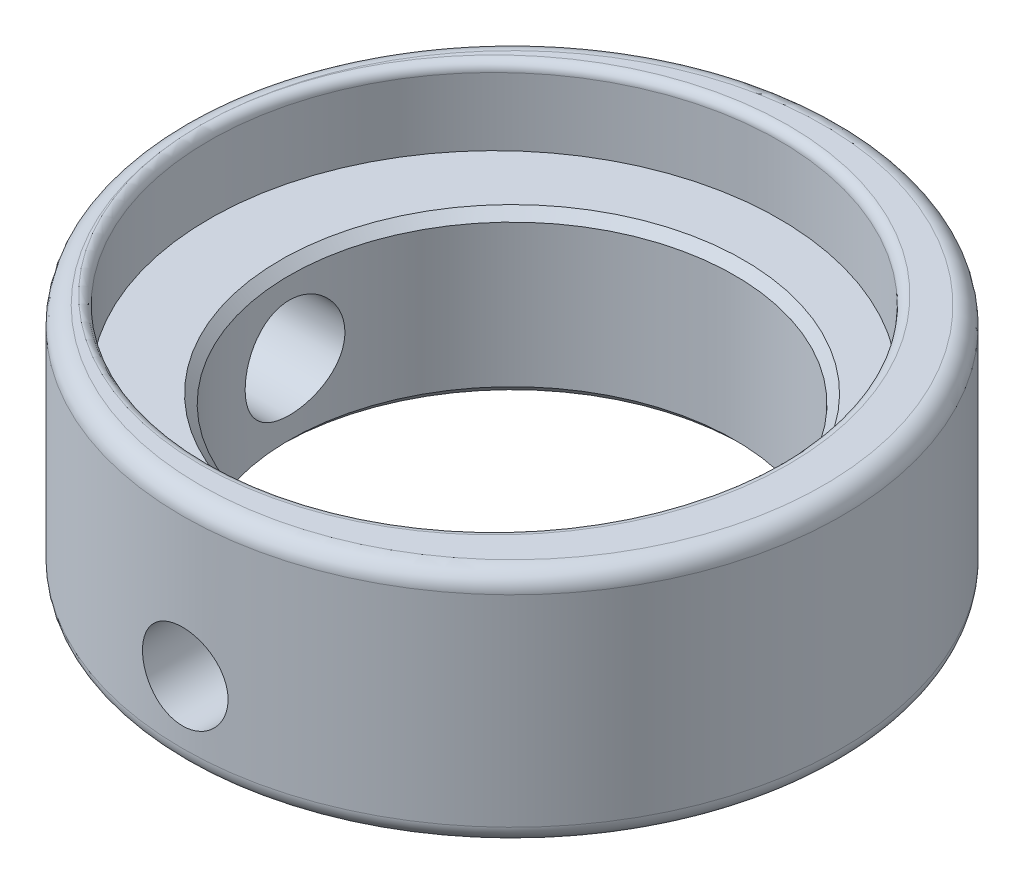
ISO-10303-21;
HEADER;
FILE_DESCRIPTION(('STEP AP214'),'2;1');
FILE_NAME('part.step','',(''),(''),'','','');
FILE_SCHEMA(('AUTOMOTIVE_DESIGN { 1 0 10303 214 1 1 1 1 }'));
ENDSEC;
DATA;
#1=APPLICATION_CONTEXT('core data for automotive mechanical design processes');
#2=APPLICATION_PROTOCOL_DEFINITION('international standard','automotive_design',2000,#1);
#3=PRODUCT_CONTEXT('',#1,'mechanical');
#4=PRODUCT('Part','Part','',(#3));
#5=PRODUCT_RELATED_PRODUCT_CATEGORY('part','',(#4));
#6=PRODUCT_DEFINITION_FORMATION('','',#4);
#7=PRODUCT_DEFINITION_CONTEXT('part definition',#1,'design');
#8=PRODUCT_DEFINITION('design','',#6,#7);
#9=PRODUCT_DEFINITION_SHAPE('','',#8);
#10=(LENGTH_UNIT() NAMED_UNIT(*) SI_UNIT(.MILLI.,.METRE.));
#11=(NAMED_UNIT(*) PLANE_ANGLE_UNIT() SI_UNIT($,.RADIAN.));
#12=(NAMED_UNIT(*) SI_UNIT($,.STERADIAN.) SOLID_ANGLE_UNIT());
#13=UNCERTAINTY_MEASURE_WITH_UNIT(LENGTH_MEASURE(1.E-05),#10,'distance_accuracy_value','');
#14=(GEOMETRIC_REPRESENTATION_CONTEXT(3) GLOBAL_UNCERTAINTY_ASSIGNED_CONTEXT((#13)) GLOBAL_UNIT_ASSIGNED_CONTEXT((#10,
#11,#12)) REPRESENTATION_CONTEXT('',''));
#15=CARTESIAN_POINT('',(0.,0.,0.));
#16=DIRECTION('',(0.,0.,1.));
#17=DIRECTION('',(1.,0.,0.));
#18=AXIS2_PLACEMENT_3D('',#15,#16,#17);
#19=CARTESIAN_POINT('',(0.,13.3,0.));
#20=DIRECTION('',(0.,-1.,0.));
#21=DIRECTION('',(0.,0.,-1.));
#22=AXIS2_PLACEMENT_3D('',#19,#20,#21);
#23=CYLINDRICAL_SURFACE('',#22,12.5);
#24=CARTESIAN_POINT('',(0.,0.500000000000006,0.));
#25=DIRECTION('',(0.,1.,0.));
#26=DIRECTION('',(0.,0.,1.));
#27=AXIS2_PLACEMENT_3D('',#24,#25,#26);
#28=CIRCLE('',#27,12.5);
#29=CARTESIAN_POINT('',(0.,0.500000000000006,12.5));
#30=VERTEX_POINT('',#29);
#31=EDGE_CURVE('E81',#30,#30,#28,.F.);
#32=ORIENTED_EDGE('',*,*,#31,.T.);
#33=EDGE_LOOP('',(#32));
#34=FACE_BOUND('',#33,.T.);
#35=CARTESIAN_POINT('',(0.,8.49999999999999,0.));
#36=DIRECTION('',(0.,1.,0.));
#37=DIRECTION('',(0.,0.,1.));
#38=AXIS2_PLACEMENT_3D('',#35,#36,#37);
#39=CIRCLE('',#38,12.5);
#40=CARTESIAN_POINT('',(0.,8.49999999999999,12.5));
#41=VERTEX_POINT('',#40);
#42=EDGE_CURVE('E71',#41,#41,#39,.T.);
#43=ORIENTED_EDGE('',*,*,#42,.T.);
#44=EDGE_LOOP('',(#43));
#45=FACE_BOUND('',#44,.T.);
#46=CARTESIAN_POINT('',(-12.1823643025482,4.5,-2.8));
#47=CARTESIAN_POINT('',(-12.1823674341913,4.65514536392574,-2.79999479581896));
#48=CARTESIAN_POINT('',(-12.1853603182129,4.81035243648876,-2.78706144254922));
#49=CARTESIAN_POINT('',(-12.1969851330559,5.11634588547394,-2.73573044738615));
#50=CARTESIAN_POINT('',(-12.2056210123745,5.26712908919167,-2.69731497494632));
#51=CARTESIAN_POINT('',(-12.2275057982099,5.55980433395264,-2.59629573068127));
#52=CARTESIAN_POINT('',(-12.2407494999159,5.70170619451899,-2.53371924145354));
#53=CARTESIAN_POINT('',(-12.2703514049555,5.9730026802323,-2.38623324156795));
#54=CARTESIAN_POINT('',(-12.2867095761564,6.10239743439727,-2.30132396131933));
#55=CARTESIAN_POINT('',(-12.321020992254,6.34729938377163,-2.10997945418038));
#56=CARTESIAN_POINT('',(-12.3389954791481,6.46255278921464,-2.00322315327442));
#57=CARTESIAN_POINT('',(-12.3743285676773,6.67367561832833,-1.77190791213655));
#58=CARTESIAN_POINT('',(-12.3916871198821,6.76954348914843,-1.64734754709853));
#59=CARTESIAN_POINT('',(-12.4240644422573,6.94018335427823,-1.38225241629933));
#60=CARTESIAN_POINT('',(-12.4390552233858,7.01471040620082,-1.24155627007642));
#61=CARTESIAN_POINT('',(-12.4647676200736,7.13896713585974,-0.949244449826382));
#62=CARTESIAN_POINT('',(-12.4754897384779,7.18869973453641,-0.797630064445024));
#63=CARTESIAN_POINT('',(-12.491306599197,7.26115525674994,-0.490425600222609));
#64=CARTESIAN_POINT('',(-12.4964907868747,7.28430795633644,-0.334941569183739));
#65=CARTESIAN_POINT('',(-12.5009578577556,7.30429103976193,-0.0222156262446369));
#66=CARTESIAN_POINT('',(-12.5002414476418,7.30112457570607,0.135026072896531));
#67=CARTESIAN_POINT('',(-12.4930561186334,7.26887755292201,0.443838229000937));
#68=CARTESIAN_POINT('',(-12.486690058832,7.24026033792319,0.595459816367369));
#69=CARTESIAN_POINT('',(-12.4690383191829,7.15866352461863,0.8916922023733));
#70=CARTESIAN_POINT('',(-12.4577524099078,7.10568279016194,1.03630267371374));
#71=CARTESIAN_POINT('',(-12.4313649323818,6.97645869198745,1.31568358483893));
#72=CARTESIAN_POINT('',(-12.4162349904277,6.90004142871706,1.4503707999034));
#73=CARTESIAN_POINT('',(-12.3838156566355,6.72624348326085,1.70517795035637));
#74=CARTESIAN_POINT('',(-12.3665259574272,6.62885981576816,1.82529580747143));
#75=CARTESIAN_POINT('',(-12.3312406041664,6.41337685287638,2.05031174025003));
#76=CARTESIAN_POINT('',(-12.3132377774948,6.29487208654792,2.15482075247097));
#77=CARTESIAN_POINT('',(-12.2789071379515,6.04183160574922,2.34255720249526));
#78=CARTESIAN_POINT('',(-12.2625793750915,5.90729541289273,2.42578400499298));
#79=CARTESIAN_POINT('',(-12.2334273969985,5.62536085655811,2.56877828276755));
#80=CARTESIAN_POINT('',(-12.2206146783272,5.47792231945013,2.62846905124591));
#81=CARTESIAN_POINT('',(-12.2001005139821,5.17475140783082,2.72210751155543));
#82=CARTESIAN_POINT('',(-12.1923982135573,5.0190204249949,2.75605950850093));
#83=CARTESIAN_POINT('',(-12.1831521517488,4.70724881794293,2.79664653475807));
#84=CARTESIAN_POINT('',(-12.1814803802331,4.55128583348394,2.80384946589389));
#85=CARTESIAN_POINT('',(-12.1841388420204,4.2403875214988,2.79227419334111));
#86=CARTESIAN_POINT('',(-12.1884686411874,4.08545212045485,2.77349786891566));
#87=CARTESIAN_POINT('',(-12.2025212112885,3.78300514151785,2.71099068139143));
#88=CARTESIAN_POINT('',(-12.2121757325051,3.63542487069364,2.66757542807073));
#89=CARTESIAN_POINT('',(-12.2357278409602,3.34963366297215,2.55736580494411));
#90=CARTESIAN_POINT('',(-12.249625850476,3.21142366020099,2.49056910831074));
#91=CARTESIAN_POINT('',(-12.2803783440658,2.94584684216637,2.33425162127811));
#92=CARTESIAN_POINT('',(-12.2972767822172,2.81869016766377,2.24438263713553));
#93=CARTESIAN_POINT('',(-12.3320115187574,2.58105397854603,2.04492474154269));
#94=CARTESIAN_POINT('',(-12.3498479393713,2.47057664465242,1.93533325559501));
#95=CARTESIAN_POINT('',(-12.3848728054435,2.26721559129358,1.69696547292542));
#96=CARTESIAN_POINT('',(-12.4020416474021,2.17471997977805,1.56785468974046));
#97=CARTESIAN_POINT('',(-12.4334296676744,2.01273023518556,1.29559856934823));
#98=CARTESIAN_POINT('',(-12.4476489871673,1.94323500109963,1.15245390435656));
#99=CARTESIAN_POINT('',(-12.4714535105365,1.82975158697143,0.857106232323216));
#100=CARTESIAN_POINT('',(-12.4810687862438,1.7855975010361,0.704969506963423));
#101=CARTESIAN_POINT('',(-12.4947121499458,1.72353431936234,0.395197133529021));
#102=CARTESIAN_POINT('',(-12.4987410920213,1.70562121168202,0.237562329820752));
#103=CARTESIAN_POINT('',(-12.5007309491807,1.69673619919542,-0.0750535642039317));
#104=CARTESIAN_POINT('',(-12.4988221242732,1.70518596985465,-0.230017668576181));
#105=CARTESIAN_POINT('',(-12.4894315694838,1.74748830842547,-0.536257306341028));
#106=CARTESIAN_POINT('',(-12.4819499494433,1.78134037564997,-0.687532912374389));
#107=CARTESIAN_POINT('',(-12.4622658152487,1.87320358663935,-0.981628556620581));
#108=CARTESIAN_POINT('',(-12.4500800560364,1.93112904258484,-1.12447655324973));
#109=CARTESIAN_POINT('',(-12.4222858198916,2.0694125611022,-1.39850100211305));
#110=CARTESIAN_POINT('',(-12.4066769935396,2.149772914011,-1.52967626089511));
#111=CARTESIAN_POINT('',(-12.3733503050104,2.33251137754991,-1.77944053646861));
#112=CARTESIAN_POINT('',(-12.3555967996477,2.43529398029021,-1.89772887725761));
#113=CARTESIAN_POINT('',(-12.3201682718499,2.65914820412998,-2.11557626324184));
#114=CARTESIAN_POINT('',(-12.3024932695042,2.78022425705114,-2.21513075676437));
#115=CARTESIAN_POINT('',(-12.2689426906656,3.03929342072657,-2.3940489050694));
#116=CARTESIAN_POINT('',(-12.2530961761995,3.17750202466997,-2.47310631399255));
#117=CARTESIAN_POINT('',(-12.2253657919086,3.46557191694274,-2.60674600790172));
#118=CARTESIAN_POINT('',(-12.213478643656,3.61542343727773,-2.66134855493822));
#119=CARTESIAN_POINT('',(-12.1971574943273,3.88780585497646,-2.7350342940965));
#120=CARTESIAN_POINT('',(-12.191647620287,4.00888423839763,-2.75934873952684));
#121=CARTESIAN_POINT('',(-12.184249876386,4.25329548835065,-2.79183322871776));
#122=CARTESIAN_POINT('',(-12.1823618122621,4.37662823360697,-2.80000413837057));
#123=CARTESIAN_POINT('',(-12.1823643025482,4.5,-2.8));
#124=B_SPLINE_CURVE_WITH_KNOTS('',3,(#46,#47,#48,#49,#50,#51,#52,#53,#54,#55,#56,#57,#58,#59,
#60,#61,#62,#63,#64,#65,#66,#67,#68,#69,#70,#71,#72,#73,#74,#75,#76,#77,#78,#79,#80,#81,#82,#83,
#84,#85,#86,#87,#88,#89,#90,#91,#92,#93,#94,#95,#96,#97,#98,#99,#100,#101,#102,#103,#104,#105,
#106,#107,#108,#109,#110,#111,#112,#113,#114,#115,#116,#117,#118,#119,#120,#121,#122,#123),
.UNSPECIFIED.,.T.,.F.,(4,2,2,2,2,2,2,2,2,2,2,2,2,2,2,2,2,2,2,2,2,2,2,2,2,2,2,2,2,2,2,2,2,2,2,2,
2,2,4),(0.,0.464983806540726,0.930293318864993,1.39507893357776,1.85985975324746,
2.33203743647014,2.80425292784182,3.28168898866939,3.75906879127034,4.22861592604121,
4.69810682647937,5.15922149508551,5.62035766916417,6.08500184038955,6.54971221390015,
7.02455753032444,7.49941701993385,7.97581158944237,8.45212645872601,8.91826904735494,
9.38437791835901,9.84464678420475,10.3049614671901,10.7726793905468,11.2404584122962,
11.7174236539562,12.1943660603824,12.6681492694531,13.1418600349914,13.6052526096118,
14.0686360508615,14.5303840438614,14.9921791931039,15.4631189891019,15.9341730597548,
16.4119050827547,16.8892405457814,17.259016021454,17.6287716629087),.UNSPECIFIED.);
#125=CARTESIAN_POINT('',(-12.1823643025482,4.5,-2.8));
#126=VERTEX_POINT('',#125);
#127=EDGE_CURVE('E104',#126,#126,#124,.T.);
#128=ORIENTED_EDGE('',*,*,#127,.F.);
#129=EDGE_LOOP('',(#128));
#130=FACE_BOUND('',#129,.T.);
#131=ADVANCED_FACE('F41',(#34,#45,#130),#23,.F.);
#132=CARTESIAN_POINT('',(0.,13.3,0.));
#133=DIRECTION('',(0.,1.,0.));
#134=DIRECTION('',(0.,0.,1.));
#135=AXIS2_PLACEMENT_3D('',#132,#133,#134);
#136=PLANE('',#135);
#137=CARTESIAN_POINT('',(0.,13.3,0.));
#138=DIRECTION('',(0.,1.,0.));
#139=DIRECTION('',(0.,0.,1.));
#140=AXIS2_PLACEMENT_3D('',#137,#138,#139);
#141=CIRCLE('',#140,17.5);
#142=CARTESIAN_POINT('',(-17.5,13.3,0.));
#143=VERTEX_POINT('',#142);
#144=EDGE_CURVE('E74',#143,#143,#141,.T.);
#145=ORIENTED_EDGE('',*,*,#144,.T.);
#146=CARTESIAN_POINT('',(-0.999999999999999,13.3,0.));
#147=DIRECTION('',(0.,1.,0.));
#148=DIRECTION('',(0.,0.,1.));
#149=AXIS2_PLACEMENT_3D('',#146,#147,#148);
#150=CIRCLE('',#149,16.5);
#151=EDGE_CURVE('E59',#143,#143,#150,.F.);
#152=ORIENTED_EDGE('',*,*,#151,.T.);
#153=EDGE_LOOP('',(#145,#152));
#154=FACE_BOUND('',#153,.T.);
#155=ADVANCED_FACE('F99',(#154),#136,.T.);
#156=CARTESIAN_POINT('',(0.,0.,0.));
#157=DIRECTION('',(0.,1.,0.));
#158=DIRECTION('',(0.,0.,1.));
#159=AXIS2_PLACEMENT_3D('',#156,#157,#158);
#160=PLANE('',#159);
#161=CARTESIAN_POINT('',(0.,0.,0.));
#162=DIRECTION('',(0.,1.,0.));
#163=DIRECTION('',(0.,0.,1.));
#164=AXIS2_PLACEMENT_3D('',#161,#162,#163);
#165=CIRCLE('',#164,13.);
#166=CARTESIAN_POINT('',(0.,0.,13.));
#167=VERTEX_POINT('',#166);
#168=EDGE_CURVE('E65',#167,#167,#165,.T.);
#169=ORIENTED_EDGE('',*,*,#168,.T.);
#170=EDGE_LOOP('',(#169));
#171=FACE_BOUND('',#170,.T.);
#172=CARTESIAN_POINT('',(0.,0.,0.));
#173=DIRECTION('',(0.,1.,0.));
#174=DIRECTION('',(0.,0.,1.));
#175=AXIS2_PLACEMENT_3D('',#172,#173,#174);
#176=CIRCLE('',#175,17.5);
#177=CARTESIAN_POINT('',(0.,0.,17.5));
#178=VERTEX_POINT('',#177);
#179=EDGE_CURVE('E173',#178,#178,#176,.F.);
#180=ORIENTED_EDGE('',*,*,#179,.T.);
#181=EDGE_LOOP('',(#180));
#182=FACE_BOUND('',#181,.T.);
#183=ADVANCED_FACE('F147',(#171,#182),#160,.F.);
#184=CARTESIAN_POINT('',(0.,13.3,0.));
#185=DIRECTION('',(0.,-1.,0.));
#186=DIRECTION('',(0.,0.,-1.));
#187=AXIS2_PLACEMENT_3D('',#184,#185,#186);
#188=CYLINDRICAL_SURFACE('',#187,18.5);
#189=CARTESIAN_POINT('',(2.4,4.5,18.3436637561857));
#190=CARTESIAN_POINT('',(2.39999432049108,4.36580092964715,18.3436657469009));
#191=CARTESIAN_POINT('',(2.38870613525888,4.23151902925445,18.3451523283762));
#192=CARTESIAN_POINT('',(2.34385552438043,3.96669534202077,18.3509354753184));
#193=CARTESIAN_POINT('',(2.31027009499074,3.8361575631812,18.3552349427323));
#194=CARTESIAN_POINT('',(2.22183440792857,3.58269450201297,18.3661488654972));
#195=CARTESIAN_POINT('',(2.16699891324939,3.45976400330991,18.3727617133709));
#196=CARTESIAN_POINT('',(2.03765186970531,3.22487170730344,18.38755536636));
#197=CARTESIAN_POINT('',(1.96314356893343,3.11290810348269,18.3957359125783));
#198=CARTESIAN_POINT('',(1.7960859093386,2.90243207734071,18.4127983385114));
#199=CARTESIAN_POINT('',(1.70344170454488,2.80399521351403,18.4216837525444));
#200=CARTESIAN_POINT('',(1.50294638444374,2.6240199848811,18.439123013371));
#201=CARTESIAN_POINT('',(1.39509449952239,2.54248247581537,18.4476768433561));
#202=CARTESIAN_POINT('',(1.1667686426612,2.39834797104803,18.4635254841571));
#203=CARTESIAN_POINT('',(1.04625100985357,2.33581959029353,18.4708156940883));
#204=CARTESIAN_POINT('',(0.79631492583563,2.23191792054958,18.48327678263));
#205=CARTESIAN_POINT('',(0.666896829626164,2.19054378836353,18.488447745711));
#206=CARTESIAN_POINT('',(0.403607444155932,2.13035147002336,18.4960628127507));
#207=CARTESIAN_POINT('',(0.269765365512667,2.11140746710333,18.4985221217208));
#208=CARTESIAN_POINT('',(0.000780827204738629,2.09622310246576,18.5004887401671));
#209=CARTESIAN_POINT('',(-0.134361577346022,2.09998178269743,18.4999961742121));
#210=CARTESIAN_POINT('',(-0.401254136735291,2.12999552930724,18.4961268167374));
#211=CARTESIAN_POINT('',(-0.533019796172554,2.15611527531774,18.4927673748102));
#212=CARTESIAN_POINT('',(-0.790281647771516,2.22989802243627,18.4835611786176));
#213=CARTESIAN_POINT('',(-0.91577771298958,2.2775614595541,18.4777143740121));
#214=CARTESIAN_POINT('',(-1.15735528719651,2.39322155389964,18.4641605077499));
#215=CARTESIAN_POINT('',(-1.27340858287288,2.46127649115695,18.4564481265134));
#216=CARTESIAN_POINT('',(-1.49249854598667,2.6157453347118,18.4400253874045));
#217=CARTESIAN_POINT('',(-1.5955345702413,2.70216014760469,18.4313149802604));
#218=CARTESIAN_POINT('',(-1.7864606593398,2.89165294845584,18.4137947231811));
#219=CARTESIAN_POINT('',(-1.87423365438337,2.99484890936805,18.4049846132107));
#220=CARTESIAN_POINT('',(-2.03123151086737,3.21457017565849,18.38832105315));
#221=CARTESIAN_POINT('',(-2.10045630578231,3.33109552884217,18.3804676064909));
#222=CARTESIAN_POINT('',(-2.2184010078773,3.57427526597035,18.3666067195323));
#223=CARTESIAN_POINT('',(-2.26711107246045,3.70093447735769,18.3606001657107));
#224=CARTESIAN_POINT('',(-2.3425373604897,3.96073024147099,18.3511301306971));
#225=CARTESIAN_POINT('',(-2.36925472868736,4.09386645667745,18.3476665171422));
#226=CARTESIAN_POINT('',(-2.39978121051201,4.36180168911813,18.3436988998678));
#227=CARTESIAN_POINT('',(-2.40375528764473,4.49658160789137,18.3431735844744));
#228=CARTESIAN_POINT('',(-2.38911807149868,4.76488533695055,18.3450856410846));
#229=CARTESIAN_POINT('',(-2.37050729774111,4.89840917605901,18.3475229449388));
#230=CARTESIAN_POINT('',(-2.31136774842077,5.15991321402705,18.3550661482833));
#231=CARTESIAN_POINT('',(-2.27091925542688,5.28791187532916,18.3601622707967));
#232=CARTESIAN_POINT('',(-2.16933524513878,5.53531053851319,18.3724409583769));
#233=CARTESIAN_POINT('',(-2.10819894822652,5.65471021613748,18.3796236020726));
#234=CARTESIAN_POINT('',(-1.96657080058124,5.88226673902087,18.3953169341202));
#235=CARTESIAN_POINT('',(-1.88597101481756,5.99035589455184,18.4038349318917));
#236=CARTESIAN_POINT('',(-1.7078559525827,6.19153155293995,18.4212164290756));
#237=CARTESIAN_POINT('',(-1.61033996630451,6.28461742594017,18.4300799429738));
#238=CARTESIAN_POINT('',(-1.40043895749473,6.45372591549102,18.4472194487399));
#239=CARTESIAN_POINT('',(-1.28796610184475,6.52963996990924,18.4554914881909));
#240=CARTESIAN_POINT('',(-1.05176979447734,6.66149781540825,18.4704565151063));
#241=CARTESIAN_POINT('',(-0.928046584426542,6.71744203533003,18.4771495364782));
#242=CARTESIAN_POINT('',(-0.6732185139343,6.80759390276094,18.4881849040373));
#243=CARTESIAN_POINT('',(-0.542135941245434,6.84186369389697,18.492533965337));
#244=CARTESIAN_POINT('',(-0.276016954879943,6.88789590239894,18.4984193319297));
#245=CARTESIAN_POINT('',(-0.14098073427984,6.89965941700442,18.499955774345));
#246=CARTESIAN_POINT('',(0.128153610970336,6.90032354443315,18.5000420149421));
#247=CARTESIAN_POINT('',(0.262251346709469,6.88939132366841,18.4986136505495));
#248=CARTESIAN_POINT('',(0.526686205671352,6.8453291050841,18.4929742788595));
#249=CARTESIAN_POINT('',(0.657023332958811,6.81219913125822,18.4887632745698));
#250=CARTESIAN_POINT('',(0.910211007050097,6.72473557462189,18.4780296146509));
#251=CARTESIAN_POINT('',(1.03306458275028,6.67041063708768,18.4715079016428));
#252=CARTESIAN_POINT('',(1.26793831477413,6.54211659316642,18.4568739431339));
#253=CARTESIAN_POINT('',(1.37995830223597,6.46814718065061,18.4487616728473));
#254=CARTESIAN_POINT('',(1.59083810847409,6.3020477186611,18.4317802091028));
#255=CARTESIAN_POINT('',(1.68959966583672,6.20979341240334,18.4229060862622));
#256=CARTESIAN_POINT('',(1.870304378522,6.01000210827181,18.4054401053191));
#257=CARTESIAN_POINT('',(1.95224355301655,5.90246150323267,18.3968483144304));
#258=CARTESIAN_POINT('',(2.09727208644594,5.67463442989092,18.3808816769707));
#259=CARTESIAN_POINT('',(2.16028164711006,5.55429682107016,18.3735120392675));
#260=CARTESIAN_POINT('',(2.26510698608867,5.30471783951609,18.360885129962));
#261=CARTESIAN_POINT('',(2.30694563087479,5.17548624526538,18.3556255805547));
#262=CARTESIAN_POINT('',(2.35831558933743,4.95466707850209,18.3490806567176));
#263=CARTESIAN_POINT('',(2.37392451696609,4.86446770292731,18.3470595482602));
#264=CARTESIAN_POINT('',(2.39476861371412,4.68285836570696,18.3443504253351));
#265=CARTESIAN_POINT('',(2.40000387023608,4.59144841426753,18.3436623996357));
#266=CARTESIAN_POINT('',(2.4,4.5,18.3436637561857));
#267=B_SPLINE_CURVE_WITH_KNOTS('',3,(#189,#190,#191,#192,#193,#194,#195,#196,#197,#198,#199,
#200,#201,#202,#203,#204,#205,#206,#207,#208,#209,#210,#211,#212,#213,#214,#215,#216,#217,#218,
#219,#220,#221,#222,#223,#224,#225,#226,#227,#228,#229,#230,#231,#232,#233,#234,#235,#236,#237,
#238,#239,#240,#241,#242,#243,#244,#245,#246,#247,#248,#249,#250,#251,#252,#253,#254,#255,#256,
#257,#258,#259,#260,#261,#262,#263,#264,#265,#266),.UNSPECIFIED.,.T.,.F.,(4,2,2,2,2,2,2,2,2,2,2,
2,2,2,2,2,2,2,2,2,2,2,2,2,2,2,2,2,2,2,2,2,2,2,2,2,2,2,4),(0.,0.402263105000402,0.80494186527292,
1.2073413738291,1.60967448542061,2.01417078801549,2.4186875682764,2.82464760581226,
3.23059146074468,3.63424731168188,4.03788612850451,4.43909941047657,4.84032081272664,
5.24270004682886,5.64509915470181,6.05046026097343,6.45582282110543,6.86137964592134,
7.26691535958435,7.66950584338038,8.07208706652954,8.47319824901901,8.87432454903136,
9.27772855618547,9.68114949434485,10.0870537392021,10.4929492669692,10.8976756957852,
11.3023823926319,11.7041187834808,12.1058547400908,12.5074270024659,12.909005523091,
13.3134128441443,13.7179157536258,14.1241006709979,14.5298459310576,14.8039658107129,
15.0780833807817),.UNSPECIFIED.);
#268=CARTESIAN_POINT('',(2.4,4.5,18.3436637561857));
#269=VERTEX_POINT('',#268);
#270=EDGE_CURVE('E11',#269,#269,#267,.T.);
#271=ORIENTED_EDGE('',*,*,#270,.T.);
#272=EDGE_LOOP('',(#271));
#273=FACE_BOUND('',#272,.T.);
#274=CARTESIAN_POINT('',(0.,0.999999999999999,0.));
#275=DIRECTION('',(0.,1.,0.));
#276=DIRECTION('',(0.,0.,1.));
#277=AXIS2_PLACEMENT_3D('',#274,#275,#276);
#278=CIRCLE('',#277,18.5);
#279=CARTESIAN_POINT('',(0.,0.999999999999999,18.5));
#280=VERTEX_POINT('',#279);
#281=EDGE_CURVE('E175',#280,#280,#278,.T.);
#282=ORIENTED_EDGE('',*,*,#281,.T.);
#283=EDGE_LOOP('',(#282));
#284=FACE_BOUND('',#283,.T.);
#285=CARTESIAN_POINT('',(0.,12.3,0.));
#286=DIRECTION('',(0.,1.,0.));
#287=DIRECTION('',(0.,0.,1.));
#288=AXIS2_PLACEMENT_3D('',#285,#286,#287);
#289=CIRCLE('',#288,18.5);
#290=CARTESIAN_POINT('',(0.,12.3,18.5));
#291=VERTEX_POINT('',#290);
#292=EDGE_CURVE('E139',#291,#291,#289,.F.);
#293=ORIENTED_EDGE('',*,*,#292,.T.);
#294=EDGE_LOOP('',(#293));
#295=FACE_BOUND('',#294,.T.);
#296=CARTESIAN_POINT('',(-18.5,1.7,0.));
#297=CARTESIAN_POINT('',(-18.499997479197,1.70000643355795,-0.156319333489624));
#298=CARTESIAN_POINT('',(-18.497997970276,1.71313476685533,-0.312728954994003));
#299=CARTESIAN_POINT('',(-18.4902139792223,1.76528727323753,-0.621175163130779));
#300=CARTESIAN_POINT('',(-18.4844258276304,1.80433655236365,-0.773207360856724));
#301=CARTESIAN_POINT('',(-18.4697149129373,1.90713644141051,-1.06839035025798));
#302=CARTESIAN_POINT('',(-18.4607945346558,1.97086826228849,-1.21154780170905));
#303=CARTESIAN_POINT('',(-18.4408044873164,2.12117794982587,-1.48511487924065));
#304=CARTESIAN_POINT('',(-18.4297351127166,2.20775268710379,-1.61552624812862));
#305=CARTESIAN_POINT('',(-18.4065793501038,2.40202370788984,-1.86095730633303));
#306=CARTESIAN_POINT('',(-18.394486293165,2.50986573215005,-1.97586101757886));
#307=CARTESIAN_POINT('',(-18.3706982371848,2.74329646410691,-2.18601433767136));
#308=CARTESIAN_POINT('',(-18.3590032612379,2.86888619926099,-2.28126280784312));
#309=CARTESIAN_POINT('',(-18.3372708056988,3.13502793101597,-2.44985440233235));
#310=CARTESIAN_POINT('',(-18.3272419445587,3.27565189720519,-2.52308512155521));
#311=CARTESIAN_POINT('',(-18.3100683783911,3.56738086407156,-2.64484408959612));
#312=CARTESIAN_POINT('',(-18.3029235132993,3.7184852825288,-2.69337370938588));
#313=CARTESIAN_POINT('',(-18.2923925261747,4.02566535891574,-2.76399230774094));
#314=CARTESIAN_POINT('',(-18.2889781734918,4.18169435446008,-2.78627997354235));
#315=CARTESIAN_POINT('',(-18.2862091104277,4.49531215948441,-2.80439755322396));
#316=CARTESIAN_POINT('',(-18.28685416279,4.65290087726725,-2.8002290133657));
#317=CARTESIAN_POINT('',(-18.2921052156085,4.96376006708978,-2.76571484111628));
#318=CARTESIAN_POINT('',(-18.2966777087376,5.11705577243393,-2.73559064502669));
#319=CARTESIAN_POINT('',(-18.3092160859252,5.41639147711823,-2.65036697947861));
#320=CARTESIAN_POINT('',(-18.3171820675677,5.56243126767042,-2.59526679180066));
#321=CARTESIAN_POINT('',(-18.3356468027955,5.84378250299694,-2.4614253767088));
#322=CARTESIAN_POINT('',(-18.3461555567215,5.9790487136103,-2.38259049766649));
#323=CARTESIAN_POINT('',(-18.3685145566424,6.23451652142805,-2.2035842134201));
#324=CARTESIAN_POINT('',(-18.3803648922265,6.35471711143719,-2.10341138289832));
#325=CARTESIAN_POINT('',(-18.4042198014289,6.57792486225631,-1.8833579343369));
#326=CARTESIAN_POINT('',(-18.4162247165742,6.6807444161027,-1.7632869631699));
#327=CARTESIAN_POINT('',(-18.4389240679908,6.86480196726279,-1.50749399505356));
#328=CARTESIAN_POINT('',(-18.4496184983338,6.9460398669503,-1.37177192730933));
#329=CARTESIAN_POINT('',(-18.4685033751276,7.08463828738257,-1.08836573428368));
#330=CARTESIAN_POINT('',(-18.4766922857659,7.14198417075765,-0.940674342015397));
#331=CARTESIAN_POINT('',(-18.4896306531353,7.23100676699257,-0.637605855985721));
#332=CARTESIAN_POINT('',(-18.4943803466369,7.26268524692453,-0.482229292091465));
#333=CARTESIAN_POINT('',(-18.4998737213641,7.29922395766553,-0.169820047145265));
#334=CARTESIAN_POINT('',(-18.5006559239739,7.30434208108056,-0.0128181811577564));
#335=CARTESIAN_POINT('',(-18.4982310927787,7.28829955578673,0.299801667896878));
#336=CARTESIAN_POINT('',(-18.4950241847725,7.26713973576816,0.455419694448323));
#337=CARTESIAN_POINT('',(-18.4850052924499,7.19935642700691,0.760072085717339));
#338=CARTESIAN_POINT('',(-18.4782111237991,7.15285873921753,0.909135076574989));
#339=CARTESIAN_POINT('',(-18.4617770051496,7.03585236861759,1.19734944502007));
#340=CARTESIAN_POINT('',(-18.4521369194225,6.96534254058722,1.33650034948391));
#341=CARTESIAN_POINT('',(-18.4309863894164,6.80170948644461,1.60207350468903));
#342=CARTESIAN_POINT('',(-18.4194626387979,6.70842286248868,1.72839399845999));
#343=CARTESIAN_POINT('',(-18.3958684090072,6.50211156276361,1.9636785704489));
#344=CARTESIAN_POINT('',(-18.3837978974852,6.38908571796338,2.07264161996233));
#345=CARTESIAN_POINT('',(-18.3603482337145,6.14535560292947,2.27105798539461));
#346=CARTESIAN_POINT('',(-18.3489757998365,6.01450976469422,2.36033831761704));
#347=CARTESIAN_POINT('',(-18.3283294138188,5.73952685652959,2.51565207296837));
#348=CARTESIAN_POINT('',(-18.3190554041807,5.59539015093141,2.58168613308856));
#349=CARTESIAN_POINT('',(-18.303704672627,5.29843034942798,2.68836550307581));
#350=CARTESIAN_POINT('',(-18.297616547443,5.14564043361894,2.72910146187985));
#351=CARTESIAN_POINT('',(-18.2892967123065,4.83528862594361,2.78431655062793));
#352=CARTESIAN_POINT('',(-18.2870647307875,4.67772707091243,2.79879752956675));
#353=CARTESIAN_POINT('',(-18.2867201576538,4.36402900121127,2.80104702103654));
#354=CARTESIAN_POINT('',(-18.2885656184707,4.20789441523701,2.78908754466196));
#355=CARTESIAN_POINT('',(-18.2960767679676,3.8998844815228,2.73937892470736));
#356=CARTESIAN_POINT('',(-18.3017424500789,3.74800912645974,2.70162982547155));
#357=CARTESIAN_POINT('',(-18.3162408979077,3.45290653650824,2.60151033479013));
#358=CARTESIAN_POINT('',(-18.325071173427,3.30967260498852,2.53915929856554));
#359=CARTESIAN_POINT('',(-18.3449068400007,3.03565463293412,2.39163298325827));
#360=CARTESIAN_POINT('',(-18.3559123073866,2.90487102954296,2.30645690316563));
#361=CARTESIAN_POINT('',(-18.3789930394779,2.65808477682902,2.11471144170833));
#362=CARTESIAN_POINT('',(-18.3910777262515,2.54223944018321,2.0079407013145));
#363=CARTESIAN_POINT('',(-18.4148768746105,2.33001370543253,1.77646227753097));
#364=CARTESIAN_POINT('',(-18.4265912495462,2.23363783498856,1.65175043342211));
#365=CARTESIAN_POINT('',(-18.4484050317943,2.06260290060642,1.38710619944599));
#366=CARTESIAN_POINT('',(-18.4584950118906,1.9880686824587,1.24709235856428));
#367=CARTESIAN_POINT('',(-18.475830761813,1.86368693190871,0.956445666112158));
#368=CARTESIAN_POINT('',(-18.4830794670515,1.81381390722434,0.805823964722568));
#369=CARTESIAN_POINT('',(-18.4922669331707,1.7514467276067,0.545444631173495));
#370=CARTESIAN_POINT('',(-18.4951518929598,1.73218379799735,0.437291834971597));
#371=CARTESIAN_POINT('',(-18.499019299085,1.70645825758622,0.219440845870888));
#372=CARTESIAN_POINT('',(-18.5000017697085,1.69999548337478,0.10974267271871));
#373=CARTESIAN_POINT('',(-18.5,1.7,0.));
#374=B_SPLINE_CURVE_WITH_KNOTS('',3,(#296,#297,#298,#299,#300,#301,#302,#303,#304,#305,#306,
#307,#308,#309,#310,#311,#312,#313,#314,#315,#316,#317,#318,#319,#320,#321,#322,#323,#324,#325,
#326,#327,#328,#329,#330,#331,#332,#333,#334,#335,#336,#337,#338,#339,#340,#341,#342,#343,#344,
#345,#346,#347,#348,#349,#350,#351,#352,#353,#354,#355,#356,#357,#358,#359,#360,#361,#362,#363,
#364,#365,#366,#367,#368,#369,#370,#371,#372,#373),.UNSPECIFIED.,.T.,.F.,(4,2,2,2,2,2,2,2,2,2,2,
2,2,2,2,2,2,2,2,2,2,2,2,2,2,2,2,2,2,2,2,2,2,2,2,2,2,2,4),(0.,0.468556978820271,
0.937568447571185,1.40622359117261,1.87481456433656,2.34673587869148,2.81868452490129,
3.29300317820779,3.76729550279217,4.23797321434231,4.7086234168784,5.17529766117021,
5.64198532618203,6.11053911972868,6.57912422122708,7.05248241001274,7.52584274003224,
7.99949264785442,8.47310994448214,8.942119846149,9.41111495769035,9.87780247626474,
10.3445122558559,10.8146739528864,11.2848635041138,11.7590337806198,12.2331910629627,
12.7056393761564,13.1780544161043,13.6456320355072,14.1132088509315,14.5804185381392,
15.0476446235032,15.5194468001106,15.9913585692154,16.4659173773984,16.9399846031467,
17.2689352869141,17.5978817711963),.UNSPECIFIED.);
#375=CARTESIAN_POINT('',(-18.5,1.7,0.));
#376=VERTEX_POINT('',#375);
#377=EDGE_CURVE('E113',#376,#376,#374,.T.);
#378=ORIENTED_EDGE('',*,*,#377,.T.);
#379=EDGE_LOOP('',(#378));
#380=FACE_BOUND('',#379,.T.);
#381=ADVANCED_FACE('F141',(#273,#284,#295,#380),#188,.T.);
#382=CARTESIAN_POINT('',(-0.999999999999999,9.,0.));
#383=DIRECTION('',(0.,1.,0.));
#384=DIRECTION('',(0.,0.,1.));
#385=AXIS2_PLACEMENT_3D('',#382,#383,#384);
#386=CYLINDRICAL_SURFACE('',#385,16.);
#387=CARTESIAN_POINT('',(-0.999999999999999,12.8,0.));
#388=DIRECTION('',(0.,1.,0.));
#389=DIRECTION('',(0.,0.,1.));
#390=AXIS2_PLACEMENT_3D('',#387,#388,#389);
#391=CIRCLE('',#390,16.);
#392=CARTESIAN_POINT('',(-0.999999999999999,12.8,16.));
#393=VERTEX_POINT('',#392);
#394=EDGE_CURVE('E66',#393,#393,#391,.T.);
#395=CARTESIAN_POINT('',(-0.999999999999999,9.,0.));
#396=DIRECTION('',(0.,1.,0.));
#397=DIRECTION('',(0.,0.,1.));
#398=AXIS2_PLACEMENT_3D('',#395,#396,#397);
#399=CIRCLE('',#398,16.);
#400=CARTESIAN_POINT('',(-0.999999999999999,9.,16.));
#401=VERTEX_POINT('',#400);
#402=EDGE_CURVE('E107',#401,#401,#399,.T.);
#403=CARTESIAN_POINT('',(-0.999999999999999,12.8,16.));
#404=CARTESIAN_POINT('',(-0.999999999999999,12.7604166666667,16.));
#405=CARTESIAN_POINT('',(-0.999999999999999,12.7208333333333,16.));
#406=CARTESIAN_POINT('',(-0.999999999999999,12.6416666666667,16.));
#407=CARTESIAN_POINT('',(-0.999999999999999,12.6020833333333,16.));
#408=CARTESIAN_POINT('',(-0.999999999999999,12.5229166666667,16.));
#409=CARTESIAN_POINT('',(-0.999999999999999,12.4833333333333,16.));
#410=CARTESIAN_POINT('',(-0.999999999999999,12.4041666666667,16.));
#411=CARTESIAN_POINT('',(-0.999999999999999,12.3645833333333,16.));
#412=CARTESIAN_POINT('',(-0.999999999999999,12.2854166666667,16.));
#413=CARTESIAN_POINT('',(-0.999999999999999,12.2458333333333,16.));
#414=CARTESIAN_POINT('',(-0.999999999999999,12.1666666666667,16.));
#415=CARTESIAN_POINT('',(-0.999999999999999,12.1270833333333,16.));
#416=CARTESIAN_POINT('',(-0.999999999999999,12.0479166666667,16.));
#417=CARTESIAN_POINT('',(-0.999999999999999,12.0083333333333,16.));
#418=CARTESIAN_POINT('',(-0.999999999999999,11.9291666666667,16.));
#419=CARTESIAN_POINT('',(-0.999999999999999,11.8895833333333,16.));
#420=CARTESIAN_POINT('',(-0.999999999999999,11.8104166666667,16.));
#421=CARTESIAN_POINT('',(-0.999999999999999,11.7708333333333,16.));
#422=CARTESIAN_POINT('',(-0.999999999999999,11.6916666666667,16.));
#423=CARTESIAN_POINT('',(-0.999999999999999,11.6520833333333,16.));
#424=CARTESIAN_POINT('',(-0.999999999999999,11.5729166666667,16.));
#425=CARTESIAN_POINT('',(-0.999999999999999,11.5333333333333,16.));
#426=CARTESIAN_POINT('',(-0.999999999999999,11.4541666666667,16.));
#427=CARTESIAN_POINT('',(-0.999999999999999,11.4145833333333,16.));
#428=CARTESIAN_POINT('',(-0.999999999999999,11.3354166666667,16.));
#429=CARTESIAN_POINT('',(-0.999999999999999,11.2958333333333,16.));
#430=CARTESIAN_POINT('',(-0.999999999999999,11.2166666666667,16.));
#431=CARTESIAN_POINT('',(-0.999999999999999,11.1770833333333,16.));
#432=CARTESIAN_POINT('',(-0.999999999999999,11.0979166666667,16.));
#433=CARTESIAN_POINT('',(-0.999999999999999,11.0583333333333,16.));
#434=CARTESIAN_POINT('',(-0.999999999999999,10.9791666666667,16.));
#435=CARTESIAN_POINT('',(-0.999999999999999,10.9395833333333,16.));
#436=CARTESIAN_POINT('',(-0.999999999999999,10.8604166666667,16.));
#437=CARTESIAN_POINT('',(-0.999999999999999,10.8208333333333,16.));
#438=CARTESIAN_POINT('',(-0.999999999999999,10.7416666666667,16.));
#439=CARTESIAN_POINT('',(-0.999999999999999,10.7020833333333,16.));
#440=CARTESIAN_POINT('',(-0.999999999999999,10.6229166666667,16.));
#441=CARTESIAN_POINT('',(-0.999999999999999,10.5833333333333,16.));
#442=CARTESIAN_POINT('',(-0.999999999999999,10.5041666666667,16.));
#443=CARTESIAN_POINT('',(-0.999999999999999,10.4645833333333,16.));
#444=CARTESIAN_POINT('',(-0.999999999999999,10.3854166666667,16.));
#445=CARTESIAN_POINT('',(-0.999999999999999,10.3458333333333,16.));
#446=CARTESIAN_POINT('',(-0.999999999999999,10.2666666666667,16.));
#447=CARTESIAN_POINT('',(-0.999999999999999,10.2270833333333,16.));
#448=CARTESIAN_POINT('',(-0.999999999999999,10.1479166666667,16.));
#449=CARTESIAN_POINT('',(-0.999999999999999,10.1083333333333,16.));
#450=CARTESIAN_POINT('',(-0.999999999999999,10.0291666666667,16.));
#451=CARTESIAN_POINT('',(-0.999999999999999,9.98958333333333,16.));
#452=CARTESIAN_POINT('',(-0.999999999999999,9.91041666666667,16.));
#453=CARTESIAN_POINT('',(-0.999999999999999,9.87083333333333,16.));
#454=CARTESIAN_POINT('',(-0.999999999999999,9.79166666666667,16.));
#455=CARTESIAN_POINT('',(-0.999999999999999,9.75208333333333,16.));
#456=CARTESIAN_POINT('',(-0.999999999999999,9.67291666666667,16.));
#457=CARTESIAN_POINT('',(-0.999999999999999,9.63333333333333,16.));
#458=CARTESIAN_POINT('',(-0.999999999999999,9.55416666666667,16.));
#459=CARTESIAN_POINT('',(-0.999999999999999,9.51458333333333,16.));
#460=CARTESIAN_POINT('',(-0.999999999999999,9.43541666666667,16.));
#461=CARTESIAN_POINT('',(-0.999999999999999,9.39583333333333,16.));
#462=CARTESIAN_POINT('',(-0.999999999999999,9.31666666666667,16.));
#463=CARTESIAN_POINT('',(-0.999999999999999,9.27708333333333,16.));
#464=CARTESIAN_POINT('',(-0.999999999999999,9.19791666666667,16.));
#465=CARTESIAN_POINT('',(-0.999999999999999,9.15833333333333,16.));
#466=CARTESIAN_POINT('',(-0.999999999999999,9.07916666666667,16.));
#467=CARTESIAN_POINT('',(-0.999999999999999,9.03958333333333,16.));
#468=CARTESIAN_POINT('',(-0.999999999999999,9.,16.));
#469=B_SPLINE_CURVE_WITH_KNOTS('',3,(#403,#404,#405,#406,#407,#408,#409,#410,#411,#412,#413,
#414,#415,#416,#417,#418,#419,#420,#421,#422,#423,#424,#425,#426,#427,#428,#429,#430,#431,#432,
#433,#434,#435,#436,#437,#438,#439,#440,#441,#442,#443,#444,#445,#446,#447,#448,#449,#450,#451,
#452,#453,#454,#455,#456,#457,#458,#459,#460,#461,#462,#463,#464,#465,#466,#467,#468),
.UNSPECIFIED.,.F.,.F.,(4,2,2,2,2,2,2,2,2,2,2,2,2,2,2,2,2,2,2,2,2,2,2,2,2,2,2,2,2,2,2,2,4),(0.,
0.118750000000001,0.2375,0.356250000000001,0.475000000000001,0.593750000000001,0.7125,0.83125,
0.950000000000001,1.06875,1.1875,1.30625,1.425,1.54375,1.6625,1.78125,1.9,2.01875,2.1375,
2.25625,2.375,2.49375,2.6125,2.73125,2.85,2.96875,3.0875,3.20625,3.325,3.44375,3.5625,3.68125,
3.8),.UNSPECIFIED.);
#470=EDGE_CURVE('BSEAM146',#393,#401,#469,.T.);
#471=ORIENTED_EDGE('',*,*,#394,.T.);
#472=ORIENTED_EDGE('',*,*,#402,.F.);
#473=ORIENTED_EDGE('',*,*,#470,.T.);
#474=ORIENTED_EDGE('',*,*,#470,.F.);
#475=EDGE_LOOP('',(#471,#473,#472,#474));
#476=FACE_BOUND('',#475,.T.);
#477=ADVANCED_FACE('F146',(#476),#386,.F.);
#478=CARTESIAN_POINT('',(-0.999999999999999,9.,0.));
#479=DIRECTION('',(0.,1.,0.));
#480=DIRECTION('',(0.,0.,1.));
#481=AXIS2_PLACEMENT_3D('',#478,#479,#480);
#482=PLANE('',#481);
#483=CARTESIAN_POINT('',(0.,9.,0.));
#484=DIRECTION('',(0.,1.,0.));
#485=DIRECTION('',(0.,0.,1.));
#486=AXIS2_PLACEMENT_3D('',#483,#484,#485);
#487=CIRCLE('',#486,13.);
#488=CARTESIAN_POINT('',(0.,9.,13.));
#489=VERTEX_POINT('',#488);
#490=EDGE_CURVE('E55',#489,#489,#487,.F.);
#491=ORIENTED_EDGE('',*,*,#490,.T.);
#492=EDGE_LOOP('',(#491));
#493=FACE_BOUND('',#492,.T.);
#494=ORIENTED_EDGE('',*,*,#402,.T.);
#495=EDGE_LOOP('',(#494));
#496=FACE_BOUND('',#495,.T.);
#497=ADVANCED_FACE('F88',(#493,#496),#482,.T.);
#498=CARTESIAN_POINT('',(-18.5,4.5,0.));
#499=DIRECTION('',(1.,0.,0.));
#500=DIRECTION('',(0.,0.,-1.));
#501=AXIS2_PLACEMENT_3D('',#498,#499,#500);
#502=CYLINDRICAL_SURFACE('',#501,2.8);
#503=ORIENTED_EDGE('',*,*,#127,.T.);
#504=EDGE_LOOP('',(#503));
#505=FACE_BOUND('',#504,.T.);
#506=ORIENTED_EDGE('',*,*,#377,.F.);
#507=EDGE_LOOP('',(#506));
#508=FACE_BOUND('',#507,.T.);
#509=ADVANCED_FACE('F125',(#505,#508),#502,.F.);
#510=CARTESIAN_POINT('',(0.,0.999999999999999,0.));
#511=DIRECTION('',(0.,1.,0.));
#512=DIRECTION('',(0.,0.,1.));
#513=AXIS2_PLACEMENT_3D('',#510,#511,#512);
#514=TOROIDAL_SURFACE('',#513,17.5,1.);
#515=ORIENTED_EDGE('',*,*,#179,.F.);
#516=EDGE_LOOP('',(#515));
#517=FACE_BOUND('',#516,.T.);
#518=ORIENTED_EDGE('',*,*,#281,.F.);
#519=EDGE_LOOP('',(#518));
#520=FACE_BOUND('',#519,.T.);
#521=ADVANCED_FACE('F129',(#517,#520),#514,.T.);
#522=CARTESIAN_POINT('',(0.,12.3,0.));
#523=DIRECTION('',(0.,1.,0.));
#524=DIRECTION('',(0.,0.,1.));
#525=AXIS2_PLACEMENT_3D('',#522,#523,#524);
#526=TOROIDAL_SURFACE('',#525,17.5,1.);
#527=ORIENTED_EDGE('',*,*,#292,.F.);
#528=EDGE_LOOP('',(#527));
#529=FACE_BOUND('',#528,.T.);
#530=ORIENTED_EDGE('',*,*,#144,.F.);
#531=EDGE_LOOP('',(#530));
#532=FACE_BOUND('',#531,.T.);
#533=ADVANCED_FACE('F152',(#529,#532),#526,.T.);
#534=CARTESIAN_POINT('',(-0.999999999999999,12.8,0.));
#535=DIRECTION('',(0.,1.,0.));
#536=DIRECTION('',(0.,0.,1.));
#537=AXIS2_PLACEMENT_3D('',#534,#535,#536);
#538=TOROIDAL_SURFACE('',#537,16.5,0.5);
#539=ORIENTED_EDGE('',*,*,#151,.F.);
#540=EDGE_LOOP('',(#539));
#541=FACE_BOUND('',#540,.T.);
#542=ORIENTED_EDGE('',*,*,#394,.F.);
#543=EDGE_LOOP('',(#542));
#544=FACE_BOUND('',#543,.T.);
#545=ADVANCED_FACE('F60',(#541,#544),#538,.T.);
#546=CARTESIAN_POINT('',(0.,0.,0.));
#547=DIRECTION('',(0.,-1.,0.));
#548=DIRECTION('',(0.,0.,-1.));
#549=AXIS2_PLACEMENT_3D('',#546,#547,#548);
#550=CONICAL_SURFACE('',#549,13.,0.78539816339744);
#551=ORIENTED_EDGE('',*,*,#31,.F.);
#552=EDGE_LOOP('',(#551));
#553=FACE_BOUND('',#552,.T.);
#554=ORIENTED_EDGE('',*,*,#168,.F.);
#555=EDGE_LOOP('',(#554));
#556=FACE_BOUND('',#555,.T.);
#557=ADVANCED_FACE('F94',(#553,#556),#550,.F.);
#558=CARTESIAN_POINT('',(0.,8.49999999999999,0.));
#559=DIRECTION('',(0.,1.,0.));
#560=DIRECTION('',(0.,0.,1.));
#561=AXIS2_PLACEMENT_3D('',#558,#559,#560);
#562=CONICAL_SURFACE('',#561,12.5,0.785398163397453);
#563=ORIENTED_EDGE('',*,*,#490,.F.);
#564=EDGE_LOOP('',(#563));
#565=FACE_BOUND('',#564,.T.);
#566=ORIENTED_EDGE('',*,*,#42,.F.);
#567=EDGE_LOOP('',(#566));
#568=FACE_BOUND('',#567,.T.);
#569=ADVANCED_FACE('F44',(#565,#568),#562,.F.);
#570=CARTESIAN_POINT('',(0.,4.5,14.9));
#571=DIRECTION('',(0.,0.,1.));
#572=DIRECTION('',(1.,0.,0.));
#573=AXIS2_PLACEMENT_3D('',#570,#571,#572);
#574=CYLINDRICAL_SURFACE('',#573,2.4);
#575=CARTESIAN_POINT('',(0.,4.5,14.9));
#576=DIRECTION('',(0.,0.,1.));
#577=DIRECTION('',(1.,0.,0.));
#578=AXIS2_PLACEMENT_3D('',#575,#576,#577);
#579=CIRCLE('',#578,2.4);
#580=CARTESIAN_POINT('',(2.4,4.5,14.9));
#581=VERTEX_POINT('',#580);
#582=EDGE_CURVE('E108',#581,#581,#579,.T.);
#583=ORIENTED_EDGE('',*,*,#582,.F.);
#584=EDGE_LOOP('',(#583));
#585=FACE_BOUND('',#584,.T.);
#586=ORIENTED_EDGE('',*,*,#270,.F.);
#587=EDGE_LOOP('',(#586));
#588=FACE_BOUND('',#587,.T.);
#589=ADVANCED_FACE('F93',(#585,#588),#574,.F.);
#590=CARTESIAN_POINT('',(0.,4.5,14.9));
#591=DIRECTION('',(0.,0.,1.));
#592=DIRECTION('',(1.,0.,0.));
#593=AXIS2_PLACEMENT_3D('',#590,#591,#592);
#594=PLANE('',#593);
#595=ORIENTED_EDGE('',*,*,#582,.T.);
#596=EDGE_LOOP('',(#595));
#597=FACE_BOUND('',#596,.T.);
#598=ADVANCED_FACE('F268',(#597),#594,.T.);
#599=CLOSED_SHELL('',(#131,#155,#183,#381,#477,#497,#509,#521,#533,#545,#557,#569,#589,#598));
#600=MANIFOLD_SOLID_BREP('B2',#599);
#601=ADVANCED_BREP_SHAPE_REPRESENTATION('',(#18,#600),#14);
#602=SHAPE_DEFINITION_REPRESENTATION(#9,#601);
ENDSEC;
END-ISO-10303-21;
